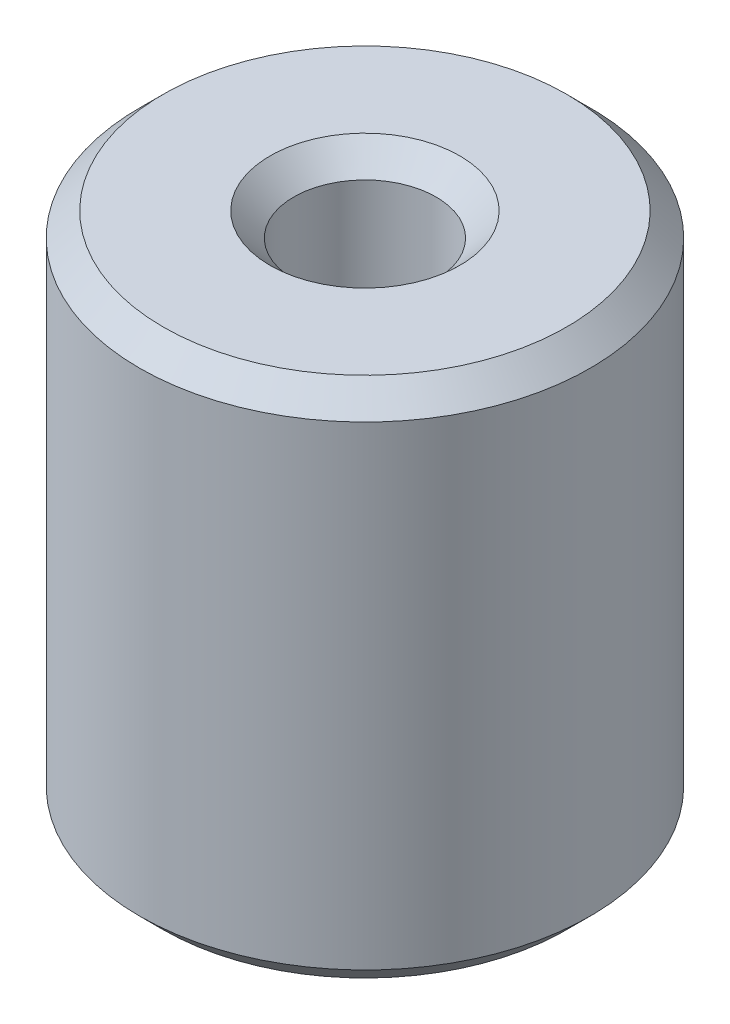
ISO-10303-21;
HEADER;
FILE_DESCRIPTION(('STEP AP214'),'2;1');
FILE_NAME('part.step','',(''),(''),'','','');
FILE_SCHEMA(('AUTOMOTIVE_DESIGN { 1 0 10303 214 1 1 1 1 }'));
ENDSEC;
DATA;
#1=APPLICATION_CONTEXT('core data for automotive mechanical design processes');
#2=APPLICATION_PROTOCOL_DEFINITION('international standard','automotive_design',2000,#1);
#3=PRODUCT_CONTEXT('',#1,'mechanical');
#4=PRODUCT('Part','Part','',(#3));
#5=PRODUCT_RELATED_PRODUCT_CATEGORY('part','',(#4));
#6=PRODUCT_DEFINITION_FORMATION('','',#4);
#7=PRODUCT_DEFINITION_CONTEXT('part definition',#1,'design');
#8=PRODUCT_DEFINITION('design','',#6,#7);
#9=PRODUCT_DEFINITION_SHAPE('','',#8);
#10=(LENGTH_UNIT() NAMED_UNIT(*) SI_UNIT(.MILLI.,.METRE.));
#11=(NAMED_UNIT(*) PLANE_ANGLE_UNIT() SI_UNIT($,.RADIAN.));
#12=(NAMED_UNIT(*) SI_UNIT($,.STERADIAN.) SOLID_ANGLE_UNIT());
#13=UNCERTAINTY_MEASURE_WITH_UNIT(LENGTH_MEASURE(1.E-05),#10,'distance_accuracy_value','');
#14=(GEOMETRIC_REPRESENTATION_CONTEXT(3) GLOBAL_UNCERTAINTY_ASSIGNED_CONTEXT((#13)) GLOBAL_UNIT_ASSIGNED_CONTEXT((#10,
#11,#12)) REPRESENTATION_CONTEXT('',''));
#15=CARTESIAN_POINT('',(0.,0.,0.));
#16=DIRECTION('',(0.,0.,1.));
#17=DIRECTION('',(1.,0.,0.));
#18=AXIS2_PLACEMENT_3D('',#15,#16,#17);
#19=CARTESIAN_POINT('',(0.,22.,0.));
#20=DIRECTION('',(0.,1.,0.));
#21=DIRECTION('',(0.,0.,1.));
#22=AXIS2_PLACEMENT_3D('',#19,#20,#21);
#23=PLANE('',#22);
#24=CARTESIAN_POINT('',(0.,22.,0.));
#25=DIRECTION('',(0.,1.,0.));
#26=DIRECTION('',(0.,0.,1.));
#27=AXIS2_PLACEMENT_3D('',#24,#25,#26);
#28=CIRCLE('',#27,4.);
#29=CARTESIAN_POINT('',(0.,22.,4.));
#30=VERTEX_POINT('',#29);
#31=EDGE_CURVE('E10',#30,#30,#28,.F.);
#32=ORIENTED_EDGE('',*,*,#31,.T.);
#33=EDGE_LOOP('',(#32));
#34=FACE_BOUND('',#33,.T.);
#35=CARTESIAN_POINT('',(0.,22.,0.));
#36=DIRECTION('',(0.,1.,0.));
#37=DIRECTION('',(0.,0.,1.));
#38=AXIS2_PLACEMENT_3D('',#35,#36,#37);
#39=CIRCLE('',#38,8.5);
#40=CARTESIAN_POINT('',(0.,22.,8.5));
#41=VERTEX_POINT('',#40);
#42=EDGE_CURVE('E48',#41,#41,#39,.T.);
#43=ORIENTED_EDGE('',*,*,#42,.T.);
#44=EDGE_LOOP('',(#43));
#45=FACE_BOUND('',#44,.T.);
#46=ADVANCED_FACE('F39',(#34,#45),#23,.T.);
#47=CARTESIAN_POINT('',(0.,0.,0.));
#48=DIRECTION('',(0.,1.,0.));
#49=DIRECTION('',(0.,0.,1.));
#50=AXIS2_PLACEMENT_3D('',#47,#48,#49);
#51=PLANE('',#50);
#52=CARTESIAN_POINT('',(0.,0.,0.));
#53=DIRECTION('',(0.,1.,0.));
#54=DIRECTION('',(0.,0.,1.));
#55=AXIS2_PLACEMENT_3D('',#52,#53,#54);
#56=CIRCLE('',#55,4.);
#57=CARTESIAN_POINT('',(0.,0.,4.));
#58=VERTEX_POINT('',#57);
#59=EDGE_CURVE('E72',#58,#58,#56,.T.);
#60=ORIENTED_EDGE('',*,*,#59,.T.);
#61=EDGE_LOOP('',(#60));
#62=FACE_BOUND('',#61,.T.);
#63=CARTESIAN_POINT('',(0.,0.,0.));
#64=DIRECTION('',(0.,1.,0.));
#65=DIRECTION('',(0.,0.,1.));
#66=AXIS2_PLACEMENT_3D('',#63,#64,#65);
#67=CIRCLE('',#66,8.49999999999999);
#68=CARTESIAN_POINT('',(0.,0.,8.49999999999999));
#69=VERTEX_POINT('',#68);
#70=EDGE_CURVE('E76',#69,#69,#67,.F.);
#71=ORIENTED_EDGE('',*,*,#70,.T.);
#72=EDGE_LOOP('',(#71));
#73=FACE_BOUND('',#72,.T.);
#74=ADVANCED_FACE('F81',(#62,#73),#51,.F.);
#75=CARTESIAN_POINT('',(0.,22.,0.));
#76=DIRECTION('',(0.,-1.,0.));
#77=DIRECTION('',(0.,0.,-1.));
#78=AXIS2_PLACEMENT_3D('',#75,#76,#77);
#79=CYLINDRICAL_SURFACE('',#78,9.5);
#80=CARTESIAN_POINT('',(0.,1.,0.));
#81=DIRECTION('',(0.,1.,0.));
#82=DIRECTION('',(0.,0.,1.));
#83=AXIS2_PLACEMENT_3D('',#80,#81,#82);
#84=CIRCLE('',#83,9.5);
#85=CARTESIAN_POINT('',(0.,1.,9.5));
#86=VERTEX_POINT('',#85);
#87=EDGE_CURVE('E53',#86,#86,#84,.T.);
#88=ORIENTED_EDGE('',*,*,#87,.T.);
#89=EDGE_LOOP('',(#88));
#90=FACE_BOUND('',#89,.T.);
#91=CARTESIAN_POINT('',(0.,21.,0.));
#92=DIRECTION('',(0.,1.,0.));
#93=DIRECTION('',(0.,0.,1.));
#94=AXIS2_PLACEMENT_3D('',#91,#92,#93);
#95=CIRCLE('',#94,9.5);
#96=CARTESIAN_POINT('',(0.,21.,9.5));
#97=VERTEX_POINT('',#96);
#98=EDGE_CURVE('E58',#97,#97,#95,.F.);
#99=ORIENTED_EDGE('',*,*,#98,.T.);
#100=EDGE_LOOP('',(#99));
#101=FACE_BOUND('',#100,.T.);
#102=ADVANCED_FACE('F91',(#90,#101),#79,.T.);
#103=CARTESIAN_POINT('',(0.,22.,0.));
#104=DIRECTION('',(0.,-1.,0.));
#105=DIRECTION('',(0.,0.,-1.));
#106=AXIS2_PLACEMENT_3D('',#103,#104,#105);
#107=CYLINDRICAL_SURFACE('',#106,3.);
#108=CARTESIAN_POINT('',(0.,1.,0.));
#109=DIRECTION('',(0.,1.,0.));
#110=DIRECTION('',(0.,0.,1.));
#111=AXIS2_PLACEMENT_3D('',#108,#109,#110);
#112=CIRCLE('',#111,3.);
#113=CARTESIAN_POINT('',(0.,1.,3.));
#114=VERTEX_POINT('',#113);
#115=EDGE_CURVE('E64',#114,#114,#112,.F.);
#116=ORIENTED_EDGE('',*,*,#115,.T.);
#117=EDGE_LOOP('',(#116));
#118=FACE_BOUND('',#117,.T.);
#119=CARTESIAN_POINT('',(0.,21.,0.));
#120=DIRECTION('',(0.,1.,0.));
#121=DIRECTION('',(0.,0.,1.));
#122=AXIS2_PLACEMENT_3D('',#119,#120,#121);
#123=CIRCLE('',#122,3.);
#124=CARTESIAN_POINT('',(0.,21.,3.));
#125=VERTEX_POINT('',#124);
#126=EDGE_CURVE('E68',#125,#125,#123,.T.);
#127=ORIENTED_EDGE('',*,*,#126,.T.);
#128=EDGE_LOOP('',(#127));
#129=FACE_BOUND('',#128,.T.);
#130=ADVANCED_FACE('F94',(#118,#129),#107,.F.);
#131=CARTESIAN_POINT('',(0.,0.,0.));
#132=DIRECTION('',(0.,-1.,0.));
#133=DIRECTION('',(0.,0.,-1.));
#134=AXIS2_PLACEMENT_3D('',#131,#132,#133);
#135=CONICAL_SURFACE('',#134,4.,0.785398163397448);
#136=ORIENTED_EDGE('',*,*,#115,.F.);
#137=EDGE_LOOP('',(#136));
#138=FACE_BOUND('',#137,.T.);
#139=ORIENTED_EDGE('',*,*,#59,.F.);
#140=EDGE_LOOP('',(#139));
#141=FACE_BOUND('',#140,.T.);
#142=ADVANCED_FACE('F87',(#138,#141),#135,.F.);
#143=CARTESIAN_POINT('',(0.,1.,0.));
#144=DIRECTION('',(0.,1.,0.));
#145=DIRECTION('',(0.,0.,1.));
#146=AXIS2_PLACEMENT_3D('',#143,#144,#145);
#147=CONICAL_SURFACE('',#146,9.5,0.785398163397451);
#148=ORIENTED_EDGE('',*,*,#70,.F.);
#149=EDGE_LOOP('',(#148));
#150=FACE_BOUND('',#149,.T.);
#151=ORIENTED_EDGE('',*,*,#87,.F.);
#152=EDGE_LOOP('',(#151));
#153=FACE_BOUND('',#152,.T.);
#154=ADVANCED_FACE('F83',(#150,#153),#147,.T.);
#155=CARTESIAN_POINT('',(0.,21.,0.));
#156=DIRECTION('',(0.,1.,0.));
#157=DIRECTION('',(0.,0.,1.));
#158=AXIS2_PLACEMENT_3D('',#155,#156,#157);
#159=CONICAL_SURFACE('',#158,3.,0.785398163397451);
#160=ORIENTED_EDGE('',*,*,#31,.F.);
#161=EDGE_LOOP('',(#160));
#162=FACE_BOUND('',#161,.T.);
#163=ORIENTED_EDGE('',*,*,#126,.F.);
#164=EDGE_LOOP('',(#163));
#165=FACE_BOUND('',#164,.T.);
#166=ADVANCED_FACE('F86',(#162,#165),#159,.F.);
#167=CARTESIAN_POINT('',(0.,22.,0.));
#168=DIRECTION('',(0.,-1.,0.));
#169=DIRECTION('',(0.,0.,-1.));
#170=AXIS2_PLACEMENT_3D('',#167,#168,#169);
#171=CONICAL_SURFACE('',#170,8.5,0.785398163397447);
#172=ORIENTED_EDGE('',*,*,#98,.F.);
#173=EDGE_LOOP('',(#172));
#174=FACE_BOUND('',#173,.T.);
#175=ORIENTED_EDGE('',*,*,#42,.F.);
#176=EDGE_LOOP('',(#175));
#177=FACE_BOUND('',#176,.T.);
#178=ADVANCED_FACE('F42',(#174,#177),#171,.T.);
#179=CLOSED_SHELL('',(#46,#74,#102,#130,#142,#154,#166,#178));
#180=MANIFOLD_SOLID_BREP('B2',#179);
#181=ADVANCED_BREP_SHAPE_REPRESENTATION('',(#18,#180),#14);
#182=SHAPE_DEFINITION_REPRESENTATION(#9,#181);
ENDSEC;
END-ISO-10303-21;
